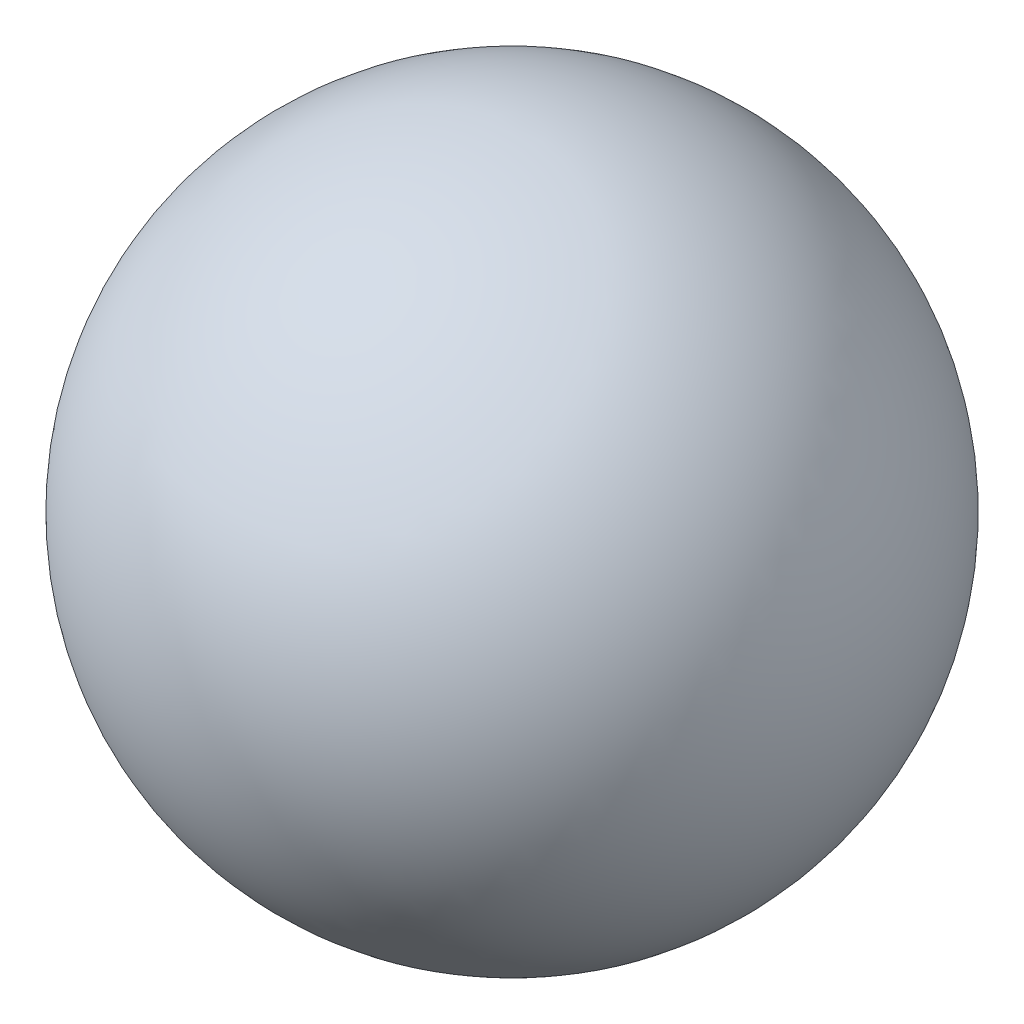
ISO-10303-21;
HEADER;
FILE_DESCRIPTION(('STEP AP214'),'2;1');
FILE_NAME('part.step','',(''),(''),'','','');
FILE_SCHEMA(('AUTOMOTIVE_DESIGN { 1 0 10303 214 1 1 1 1 }'));
ENDSEC;
DATA;
#1=APPLICATION_CONTEXT('core data for automotive mechanical design processes');
#2=APPLICATION_PROTOCOL_DEFINITION('international standard','automotive_design',2000,#1);
#3=PRODUCT_CONTEXT('',#1,'mechanical');
#4=PRODUCT('Part','Part','',(#3));
#5=PRODUCT_RELATED_PRODUCT_CATEGORY('part','',(#4));
#6=PRODUCT_DEFINITION_FORMATION('','',#4);
#7=PRODUCT_DEFINITION_CONTEXT('part definition',#1,'design');
#8=PRODUCT_DEFINITION('design','',#6,#7);
#9=PRODUCT_DEFINITION_SHAPE('','',#8);
#10=(LENGTH_UNIT() NAMED_UNIT(*) SI_UNIT(.MILLI.,.METRE.));
#11=(NAMED_UNIT(*) PLANE_ANGLE_UNIT() SI_UNIT($,.RADIAN.));
#12=(NAMED_UNIT(*) SI_UNIT($,.STERADIAN.) SOLID_ANGLE_UNIT());
#13=UNCERTAINTY_MEASURE_WITH_UNIT(LENGTH_MEASURE(1.E-05),#10,'distance_accuracy_value','');
#14=(GEOMETRIC_REPRESENTATION_CONTEXT(3) GLOBAL_UNCERTAINTY_ASSIGNED_CONTEXT((#13)) GLOBAL_UNIT_ASSIGNED_CONTEXT((#10,
#11,#12)) REPRESENTATION_CONTEXT('',''));
#15=CARTESIAN_POINT('',(0.,0.,0.));
#16=DIRECTION('',(0.,0.,1.));
#17=DIRECTION('',(1.,0.,0.));
#18=AXIS2_PLACEMENT_3D('',#15,#16,#17);
#19=CARTESIAN_POINT('',(0.,0.,0.));
#20=DIRECTION('',(0.,1.,0.));
#21=DIRECTION('',(1.,0.,0.));
#22=AXIS2_PLACEMENT_3D('',#19,#20,#21);
#23=SPHERICAL_SURFACE('',#22,21.);
#24=CARTESIAN_POINT('',(0.,21.,0.));
#25=VERTEX_POINT('',#24);
#26=VERTEX_LOOP('',#25);
#27=FACE_BOUND('',#26,.T.);
#28=ADVANCED_FACE('F35',(#27),#23,.T.);
#29=CLOSED_SHELL('',(#28));
#30=MANIFOLD_SOLID_BREP('B2',#29);
#31=ADVANCED_BREP_SHAPE_REPRESENTATION('',(#18,#30),#14);
#32=SHAPE_DEFINITION_REPRESENTATION(#9,#31);
ENDSEC;
END-ISO-10303-21;
